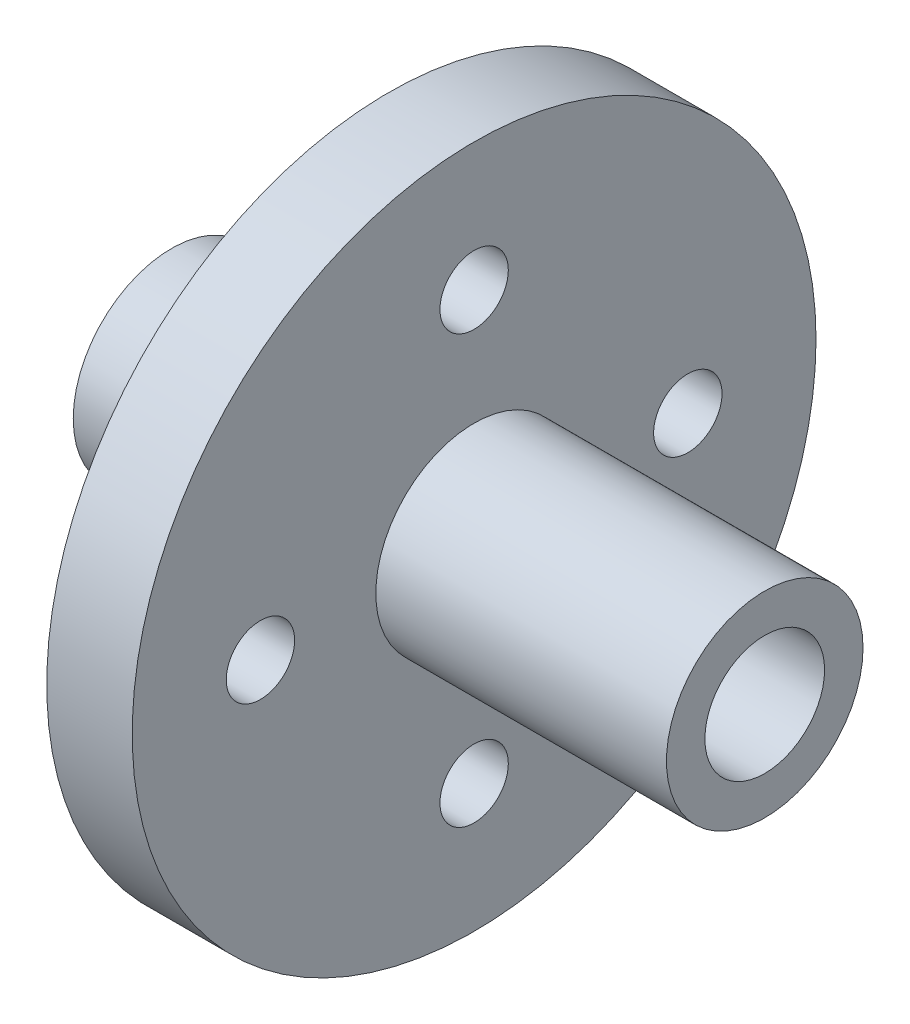
ISO-10303-21;
HEADER;
FILE_DESCRIPTION(('STEP AP214'),'2;1');
FILE_NAME('part.step','',(''),(''),'','','');
FILE_SCHEMA(('AUTOMOTIVE_DESIGN { 1 0 10303 214 1 1 1 1 }'));
ENDSEC;
DATA;
#1=APPLICATION_CONTEXT('core data for automotive mechanical design processes');
#2=APPLICATION_PROTOCOL_DEFINITION('international standard','automotive_design',2000,#1);
#3=PRODUCT_CONTEXT('',#1,'mechanical');
#4=PRODUCT('Part','Part','',(#3));
#5=PRODUCT_RELATED_PRODUCT_CATEGORY('part','',(#4));
#6=PRODUCT_DEFINITION_FORMATION('','',#4);
#7=PRODUCT_DEFINITION_CONTEXT('part definition',#1,'design');
#8=PRODUCT_DEFINITION('design','',#6,#7);
#9=PRODUCT_DEFINITION_SHAPE('','',#8);
#10=(LENGTH_UNIT() NAMED_UNIT(*) SI_UNIT(.MILLI.,.METRE.));
#11=(NAMED_UNIT(*) PLANE_ANGLE_UNIT() SI_UNIT($,.RADIAN.));
#12=(NAMED_UNIT(*) SI_UNIT($,.STERADIAN.) SOLID_ANGLE_UNIT());
#13=UNCERTAINTY_MEASURE_WITH_UNIT(LENGTH_MEASURE(1.E-05),#10,'distance_accuracy_value','');
#14=(GEOMETRIC_REPRESENTATION_CONTEXT(3) GLOBAL_UNCERTAINTY_ASSIGNED_CONTEXT((#13)) GLOBAL_UNIT_ASSIGNED_CONTEXT((#10,
#11,#12)) REPRESENTATION_CONTEXT('',''));
#15=CARTESIAN_POINT('',(0.,0.,0.));
#16=DIRECTION('',(0.,0.,1.));
#17=DIRECTION('',(1.,0.,0.));
#18=AXIS2_PLACEMENT_3D('',#15,#16,#17);
#19=CARTESIAN_POINT('',(5.,0.,0.));
#20=DIRECTION('',(1.,0.,0.));
#21=DIRECTION('',(0.,0.,-1.));
#22=AXIS2_PLACEMENT_3D('',#19,#20,#21);
#23=PLANE('',#22);
#24=CARTESIAN_POINT('',(5.,0.,-12.5));
#25=DIRECTION('',(1.,0.,0.));
#26=DIRECTION('',(0.,0.,-1.));
#27=AXIS2_PLACEMENT_3D('',#24,#25,#26);
#28=CIRCLE('',#27,2.);
#29=CARTESIAN_POINT('',(5.,0.,-14.5));
#30=VERTEX_POINT('',#29);
#31=EDGE_CURVE('E70',#30,#30,#28,.T.);
#32=ORIENTED_EDGE('',*,*,#31,.F.);
#33=EDGE_LOOP('',(#32));
#34=FACE_BOUND('',#33,.T.);
#35=CARTESIAN_POINT('',(5.,-12.5,0.));
#36=DIRECTION('',(1.,0.,0.));
#37=DIRECTION('',(0.,0.,-1.));
#38=AXIS2_PLACEMENT_3D('',#35,#36,#37);
#39=CIRCLE('',#38,2.);
#40=CARTESIAN_POINT('',(5.,-12.5,-2.));
#41=VERTEX_POINT('',#40);
#42=EDGE_CURVE('E59',#41,#41,#39,.T.);
#43=ORIENTED_EDGE('',*,*,#42,.F.);
#44=EDGE_LOOP('',(#43));
#45=FACE_BOUND('',#44,.T.);
#46=CARTESIAN_POINT('',(5.,0.,12.5));
#47=DIRECTION('',(1.,0.,0.));
#48=DIRECTION('',(0.,0.,-1.));
#49=AXIS2_PLACEMENT_3D('',#46,#47,#48);
#50=CIRCLE('',#49,2.);
#51=CARTESIAN_POINT('',(5.,0.,10.5));
#52=VERTEX_POINT('',#51);
#53=EDGE_CURVE('E58',#52,#52,#50,.T.);
#54=ORIENTED_EDGE('',*,*,#53,.F.);
#55=EDGE_LOOP('',(#54));
#56=FACE_BOUND('',#55,.T.);
#57=CARTESIAN_POINT('',(5.,12.5,0.));
#58=DIRECTION('',(1.,0.,0.));
#59=DIRECTION('',(0.,0.,-1.));
#60=AXIS2_PLACEMENT_3D('',#57,#58,#59);
#61=CIRCLE('',#60,2.);
#62=CARTESIAN_POINT('',(5.,12.5,-2.));
#63=VERTEX_POINT('',#62);
#64=EDGE_CURVE('E75',#63,#63,#61,.T.);
#65=ORIENTED_EDGE('',*,*,#64,.F.);
#66=EDGE_LOOP('',(#65));
#67=FACE_BOUND('',#66,.T.);
#68=CARTESIAN_POINT('',(5.,0.,0.));
#69=DIRECTION('',(1.,0.,0.));
#70=DIRECTION('',(0.,0.,-1.));
#71=AXIS2_PLACEMENT_3D('',#68,#69,#70);
#72=CIRCLE('',#71,5.75);
#73=CARTESIAN_POINT('',(5.,0.,-5.75));
#74=VERTEX_POINT('',#73);
#75=EDGE_CURVE('E11',#74,#74,#72,.T.);
#76=ORIENTED_EDGE('',*,*,#75,.F.);
#77=EDGE_LOOP('',(#76));
#78=FACE_BOUND('',#77,.T.);
#79=CARTESIAN_POINT('',(5.,0.,0.));
#80=DIRECTION('',(1.,0.,0.));
#81=DIRECTION('',(0.,0.,-1.));
#82=AXIS2_PLACEMENT_3D('',#79,#80,#81);
#83=CIRCLE('',#82,20.);
#84=CARTESIAN_POINT('',(5.,0.,-20.));
#85=VERTEX_POINT('',#84);
#86=EDGE_CURVE('E40',#85,#85,#83,.T.);
#87=ORIENTED_EDGE('',*,*,#86,.T.);
#88=EDGE_LOOP('',(#87));
#89=FACE_BOUND('',#88,.T.);
#90=ADVANCED_FACE('F32',(#34,#45,#56,#67,#78,#89),#23,.T.);
#91=CARTESIAN_POINT('',(0.,0.,0.));
#92=DIRECTION('',(1.,0.,0.));
#93=DIRECTION('',(0.,0.,-1.));
#94=AXIS2_PLACEMENT_3D('',#91,#92,#93);
#95=PLANE('',#94);
#96=CARTESIAN_POINT('',(0.,0.,-12.5));
#97=DIRECTION('',(1.,0.,0.));
#98=DIRECTION('',(0.,0.,-1.));
#99=AXIS2_PLACEMENT_3D('',#96,#97,#98);
#100=CIRCLE('',#99,2.);
#101=CARTESIAN_POINT('',(0.,0.,-14.5));
#102=VERTEX_POINT('',#101);
#103=EDGE_CURVE('E36',#102,#102,#100,.T.);
#104=ORIENTED_EDGE('',*,*,#103,.T.);
#105=EDGE_LOOP('',(#104));
#106=FACE_BOUND('',#105,.T.);
#107=CARTESIAN_POINT('',(0.,-12.5,0.));
#108=DIRECTION('',(1.,0.,0.));
#109=DIRECTION('',(0.,0.,-1.));
#110=AXIS2_PLACEMENT_3D('',#107,#108,#109);
#111=CIRCLE('',#110,2.);
#112=CARTESIAN_POINT('',(0.,-12.5,-2.));
#113=VERTEX_POINT('',#112);
#114=EDGE_CURVE('E56',#113,#113,#111,.T.);
#115=ORIENTED_EDGE('',*,*,#114,.T.);
#116=EDGE_LOOP('',(#115));
#117=FACE_BOUND('',#116,.T.);
#118=CARTESIAN_POINT('',(0.,0.,12.5));
#119=DIRECTION('',(1.,0.,0.));
#120=DIRECTION('',(0.,0.,-1.));
#121=AXIS2_PLACEMENT_3D('',#118,#119,#120);
#122=CIRCLE('',#121,2.);
#123=CARTESIAN_POINT('',(0.,0.,10.5));
#124=VERTEX_POINT('',#123);
#125=EDGE_CURVE('E63',#124,#124,#122,.T.);
#126=ORIENTED_EDGE('',*,*,#125,.T.);
#127=EDGE_LOOP('',(#126));
#128=FACE_BOUND('',#127,.T.);
#129=CARTESIAN_POINT('',(0.,12.5,0.));
#130=DIRECTION('',(1.,0.,0.));
#131=DIRECTION('',(0.,0.,-1.));
#132=AXIS2_PLACEMENT_3D('',#129,#130,#131);
#133=CIRCLE('',#132,2.);
#134=CARTESIAN_POINT('',(0.,12.5,-2.));
#135=VERTEX_POINT('',#134);
#136=EDGE_CURVE('E78',#135,#135,#133,.T.);
#137=ORIENTED_EDGE('',*,*,#136,.T.);
#138=EDGE_LOOP('',(#137));
#139=FACE_BOUND('',#138,.T.);
#140=CARTESIAN_POINT('',(0.,0.,0.));
#141=DIRECTION('',(1.,0.,0.));
#142=DIRECTION('',(0.,0.,-1.));
#143=AXIS2_PLACEMENT_3D('',#140,#141,#142);
#144=CIRCLE('',#143,5.75);
#145=CARTESIAN_POINT('',(0.,0.,-5.75));
#146=VERTEX_POINT('',#145);
#147=EDGE_CURVE('E53',#146,#146,#144,.T.);
#148=ORIENTED_EDGE('',*,*,#147,.T.);
#149=EDGE_LOOP('',(#148));
#150=FACE_BOUND('',#149,.T.);
#151=CARTESIAN_POINT('',(0.,0.,0.));
#152=DIRECTION('',(1.,0.,0.));
#153=DIRECTION('',(0.,0.,-1.));
#154=AXIS2_PLACEMENT_3D('',#151,#152,#153);
#155=CIRCLE('',#154,20.);
#156=CARTESIAN_POINT('',(0.,0.,-20.));
#157=VERTEX_POINT('',#156);
#158=EDGE_CURVE('E45',#157,#157,#155,.T.);
#159=ORIENTED_EDGE('',*,*,#158,.F.);
#160=EDGE_LOOP('',(#159));
#161=FACE_BOUND('',#160,.T.);
#162=ADVANCED_FACE('F110',(#106,#117,#128,#139,#150,#161),#95,.F.);
#163=CARTESIAN_POINT('',(5.,0.,0.));
#164=DIRECTION('',(-1.,0.,0.));
#165=DIRECTION('',(0.,0.,1.));
#166=AXIS2_PLACEMENT_3D('',#163,#164,#165);
#167=CYLINDRICAL_SURFACE('',#166,20.);
#168=ORIENTED_EDGE('',*,*,#86,.F.);
#169=EDGE_LOOP('',(#168));
#170=FACE_BOUND('',#169,.T.);
#171=ORIENTED_EDGE('',*,*,#158,.T.);
#172=EDGE_LOOP('',(#171));
#173=FACE_BOUND('',#172,.T.);
#174=ADVANCED_FACE('F34',(#170,#173),#167,.T.);
#175=CARTESIAN_POINT('',(55.2634559672906,0.,0.));
#176=DIRECTION('',(-1.,0.,0.));
#177=DIRECTION('',(0.,0.,1.));
#178=AXIS2_PLACEMENT_3D('',#175,#176,#177);
#179=CYLINDRICAL_SURFACE('',#178,5.75);
#180=CARTESIAN_POINT('',(-12.7,0.,0.));
#181=DIRECTION('',(-1.,0.,0.));
#182=DIRECTION('',(0.,0.,1.));
#183=AXIS2_PLACEMENT_3D('',#180,#181,#182);
#184=CIRCLE('',#183,5.75);
#185=CARTESIAN_POINT('',(-12.7,0.,5.75));
#186=VERTEX_POINT('',#185);
#187=EDGE_CURVE('E84',#186,#186,#184,.T.);
#188=ORIENTED_EDGE('',*,*,#187,.F.);
#189=EDGE_LOOP('',(#188));
#190=FACE_BOUND('',#189,.T.);
#191=ORIENTED_EDGE('',*,*,#147,.F.);
#192=EDGE_LOOP('',(#191));
#193=FACE_BOUND('',#192,.T.);
#194=ADVANCED_FACE('F107',(#190,#193),#179,.T.);
#195=CARTESIAN_POINT('',(-12.7,0.,0.));
#196=DIRECTION('',(-1.,0.,0.));
#197=DIRECTION('',(0.,0.,1.));
#198=AXIS2_PLACEMENT_3D('',#195,#196,#197);
#199=PLANE('',#198);
#200=ORIENTED_EDGE('',*,*,#187,.T.);
#201=EDGE_LOOP('',(#200));
#202=FACE_BOUND('',#201,.T.);
#203=CARTESIAN_POINT('',(-12.7,0.,0.));
#204=DIRECTION('',(-1.,0.,0.));
#205=DIRECTION('',(0.,0.,1.));
#206=AXIS2_PLACEMENT_3D('',#203,#204,#205);
#207=CIRCLE('',#206,3.5);
#208=CARTESIAN_POINT('',(-12.7,0.,3.5));
#209=VERTEX_POINT('',#208);
#210=EDGE_CURVE('E81',#209,#209,#207,.T.);
#211=ORIENTED_EDGE('',*,*,#210,.F.);
#212=EDGE_LOOP('',(#211));
#213=FACE_BOUND('',#212,.T.);
#214=ADVANCED_FACE('F120',(#202,#213),#199,.T.);
#215=CARTESIAN_POINT('',(5.,0.,0.));
#216=DIRECTION('',(-1.,0.,0.));
#217=DIRECTION('',(0.,0.,1.));
#218=AXIS2_PLACEMENT_3D('',#215,#216,#217);
#219=CYLINDRICAL_SURFACE('',#218,3.5);
#220=ORIENTED_EDGE('',*,*,#210,.T.);
#221=EDGE_LOOP('',(#220));
#222=FACE_BOUND('',#221,.T.);
#223=CARTESIAN_POINT('',(22.,0.,0.));
#224=DIRECTION('',(1.,0.,0.));
#225=DIRECTION('',(0.,0.,-1.));
#226=AXIS2_PLACEMENT_3D('',#223,#224,#225);
#227=CIRCLE('',#226,3.5);
#228=CARTESIAN_POINT('',(22.,0.,-3.5));
#229=VERTEX_POINT('',#228);
#230=EDGE_CURVE('E55',#229,#229,#227,.F.);
#231=ORIENTED_EDGE('',*,*,#230,.F.);
#232=EDGE_LOOP('',(#231));
#233=FACE_BOUND('',#232,.T.);
#234=ADVANCED_FACE('F105',(#222,#233),#219,.F.);
#235=ORIENTED_EDGE('',*,*,#75,.T.);
#236=EDGE_LOOP('',(#235));
#237=FACE_BOUND('',#236,.T.);
#238=CARTESIAN_POINT('',(22.,0.,0.));
#239=DIRECTION('',(1.,0.,0.));
#240=DIRECTION('',(0.,0.,-1.));
#241=AXIS2_PLACEMENT_3D('',#238,#239,#240);
#242=CIRCLE('',#241,5.75);
#243=CARTESIAN_POINT('',(22.,0.,-5.75));
#244=VERTEX_POINT('',#243);
#245=EDGE_CURVE('E48',#244,#244,#242,.F.);
#246=ORIENTED_EDGE('',*,*,#245,.T.);
#247=EDGE_LOOP('',(#246));
#248=FACE_BOUND('',#247,.T.);
#249=ADVANCED_FACE('F92',(#237,#248),#179,.T.);
#250=CARTESIAN_POINT('',(22.,0.,0.));
#251=DIRECTION('',(1.,0.,0.));
#252=DIRECTION('',(0.,0.,-1.));
#253=AXIS2_PLACEMENT_3D('',#250,#251,#252);
#254=PLANE('',#253);
#255=ORIENTED_EDGE('',*,*,#245,.F.);
#256=EDGE_LOOP('',(#255));
#257=FACE_BOUND('',#256,.T.);
#258=ORIENTED_EDGE('',*,*,#230,.T.);
#259=EDGE_LOOP('',(#258));
#260=FACE_BOUND('',#259,.T.);
#261=ADVANCED_FACE('F94',(#257,#260),#254,.T.);
#262=CARTESIAN_POINT('',(5.,12.5,0.));
#263=DIRECTION('',(1.,0.,0.));
#264=DIRECTION('',(0.,0.,-1.));
#265=AXIS2_PLACEMENT_3D('',#262,#263,#264);
#266=CYLINDRICAL_SURFACE('',#265,2.);
#267=ORIENTED_EDGE('',*,*,#64,.T.);
#268=EDGE_LOOP('',(#267));
#269=FACE_BOUND('',#268,.T.);
#270=ORIENTED_EDGE('',*,*,#136,.F.);
#271=EDGE_LOOP('',(#270));
#272=FACE_BOUND('',#271,.T.);
#273=ADVANCED_FACE('F96',(#269,#272),#266,.F.);
#274=CARTESIAN_POINT('',(5.,0.,12.5));
#275=DIRECTION('',(1.,0.,0.));
#276=DIRECTION('',(0.,0.,-1.));
#277=AXIS2_PLACEMENT_3D('',#274,#275,#276);
#278=CYLINDRICAL_SURFACE('',#277,2.);
#279=ORIENTED_EDGE('',*,*,#53,.T.);
#280=EDGE_LOOP('',(#279));
#281=FACE_BOUND('',#280,.T.);
#282=ORIENTED_EDGE('',*,*,#125,.F.);
#283=EDGE_LOOP('',(#282));
#284=FACE_BOUND('',#283,.T.);
#285=ADVANCED_FACE('F102',(#281,#284),#278,.F.);
#286=CARTESIAN_POINT('',(5.,-12.5,0.));
#287=DIRECTION('',(1.,0.,0.));
#288=DIRECTION('',(0.,0.,-1.));
#289=AXIS2_PLACEMENT_3D('',#286,#287,#288);
#290=CYLINDRICAL_SURFACE('',#289,2.);
#291=ORIENTED_EDGE('',*,*,#42,.T.);
#292=EDGE_LOOP('',(#291));
#293=FACE_BOUND('',#292,.T.);
#294=ORIENTED_EDGE('',*,*,#114,.F.);
#295=EDGE_LOOP('',(#294));
#296=FACE_BOUND('',#295,.T.);
#297=ADVANCED_FACE('F137',(#293,#296),#290,.F.);
#298=CARTESIAN_POINT('',(5.,0.,-12.5));
#299=DIRECTION('',(1.,0.,0.));
#300=DIRECTION('',(0.,0.,-1.));
#301=AXIS2_PLACEMENT_3D('',#298,#299,#300);
#302=CYLINDRICAL_SURFACE('',#301,2.);
#303=ORIENTED_EDGE('',*,*,#31,.T.);
#304=EDGE_LOOP('',(#303));
#305=FACE_BOUND('',#304,.T.);
#306=ORIENTED_EDGE('',*,*,#103,.F.);
#307=EDGE_LOOP('',(#306));
#308=FACE_BOUND('',#307,.T.);
#309=ADVANCED_FACE('F141',(#305,#308),#302,.F.);
#310=CLOSED_SHELL('',(#90,#162,#174,#194,#214,#234,#249,#261,#273,#285,#297,#309));
#311=MANIFOLD_SOLID_BREP('B2',#310);
#312=ADVANCED_BREP_SHAPE_REPRESENTATION('',(#18,#311),#14);
#313=SHAPE_DEFINITION_REPRESENTATION(#9,#312);
ENDSEC;
END-ISO-10303-21;
